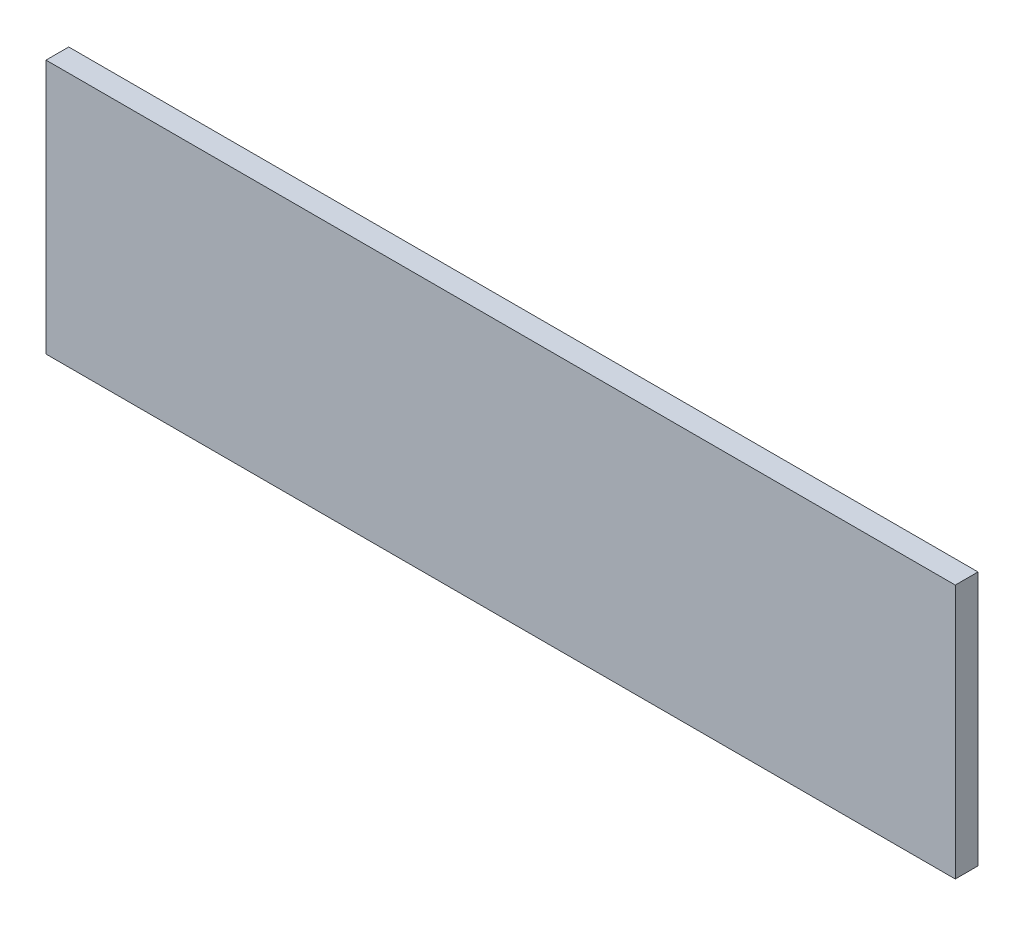
ISO-10303-21;
HEADER;
FILE_DESCRIPTION(('STEP AP214'),'2;1');
FILE_NAME('part.step','',(''),(''),'','','');
FILE_SCHEMA(('AUTOMOTIVE_DESIGN { 1 0 10303 214 1 1 1 1 }'));
ENDSEC;
DATA;
#1=APPLICATION_CONTEXT('core data for automotive mechanical design processes');
#2=APPLICATION_PROTOCOL_DEFINITION('international standard','automotive_design',2000,#1);
#3=PRODUCT_CONTEXT('',#1,'mechanical');
#4=PRODUCT('Part','Part','',(#3));
#5=PRODUCT_RELATED_PRODUCT_CATEGORY('part','',(#4));
#6=PRODUCT_DEFINITION_FORMATION('','',#4);
#7=PRODUCT_DEFINITION_CONTEXT('part definition',#1,'design');
#8=PRODUCT_DEFINITION('design','',#6,#7);
#9=PRODUCT_DEFINITION_SHAPE('','',#8);
#10=(LENGTH_UNIT() NAMED_UNIT(*) SI_UNIT(.MILLI.,.METRE.));
#11=(NAMED_UNIT(*) PLANE_ANGLE_UNIT() SI_UNIT($,.RADIAN.));
#12=(NAMED_UNIT(*) SI_UNIT($,.STERADIAN.) SOLID_ANGLE_UNIT());
#13=UNCERTAINTY_MEASURE_WITH_UNIT(LENGTH_MEASURE(1.E-05),#10,'distance_accuracy_value','');
#14=(GEOMETRIC_REPRESENTATION_CONTEXT(3) GLOBAL_UNCERTAINTY_ASSIGNED_CONTEXT((#13)) GLOBAL_UNIT_ASSIGNED_CONTEXT((#10,
#11,#12)) REPRESENTATION_CONTEXT('',''));
#15=CARTESIAN_POINT('',(0.,0.,0.));
#16=DIRECTION('',(0.,0.,1.));
#17=DIRECTION('',(1.,0.,0.));
#18=AXIS2_PLACEMENT_3D('',#15,#16,#17);
#19=CARTESIAN_POINT('',(0.,0.,3.175));
#20=DIRECTION('',(1.,0.,0.));
#21=DIRECTION('',(0.,1.,0.));
#22=AXIS2_PLACEMENT_3D('',#19,#20,#21);
#23=PLANE('',#22);
#24=DIRECTION('',(0.,-1.,0.));
#25=VECTOR('',#24,1.);
#26=CARTESIAN_POINT('',(0.,0.,0.));
#27=LINE('',#26,#25);
#28=CARTESIAN_POINT('',(0.,35.56,0.));
#29=VERTEX_POINT('',#28);
#30=CARTESIAN_POINT('',(0.,0.,0.));
#31=VERTEX_POINT('',#30);
#32=EDGE_CURVE('E97',#29,#31,#27,.T.);
#33=ORIENTED_EDGE('',*,*,#32,.T.);
#34=DIRECTION('',(0.,0.,-1.));
#35=VECTOR('',#34,1.);
#36=CARTESIAN_POINT('',(0.,0.,3.175));
#37=LINE('',#36,#35);
#38=CARTESIAN_POINT('',(0.,0.,3.175));
#39=VERTEX_POINT('',#38);
#40=EDGE_CURVE('E11',#39,#31,#37,.T.);
#41=ORIENTED_EDGE('',*,*,#40,.F.);
#42=DIRECTION('',(0.,-1.,0.));
#43=VECTOR('',#42,1.);
#44=CARTESIAN_POINT('',(0.,0.,3.175));
#45=LINE('',#44,#43);
#46=CARTESIAN_POINT('',(0.,35.56,3.175));
#47=VERTEX_POINT('',#46);
#48=EDGE_CURVE('E85',#47,#39,#45,.T.);
#49=ORIENTED_EDGE('',*,*,#48,.F.);
#50=DIRECTION('',(0.,0.,-1.));
#51=VECTOR('',#50,1.);
#52=CARTESIAN_POINT('',(0.,35.56,3.175));
#53=LINE('',#52,#51);
#54=EDGE_CURVE('E93',#47,#29,#53,.T.);
#55=ORIENTED_EDGE('',*,*,#54,.T.);
#56=EDGE_LOOP('',(#33,#41,#49,#55));
#57=FACE_BOUND('',#56,.T.);
#58=ADVANCED_FACE('F34',(#57),#23,.F.);
#59=CARTESIAN_POINT('',(0.,0.,3.175));
#60=DIRECTION('',(0.,1.,0.));
#61=DIRECTION('',(0.,0.,1.));
#62=AXIS2_PLACEMENT_3D('',#59,#60,#61);
#63=PLANE('',#62);
#64=DIRECTION('',(1.,0.,0.));
#65=VECTOR('',#64,1.);
#66=CARTESIAN_POINT('',(0.,0.,0.));
#67=LINE('',#66,#65);
#68=CARTESIAN_POINT('',(127.,0.,0.));
#69=VERTEX_POINT('',#68);
#70=EDGE_CURVE('E89',#31,#69,#67,.T.);
#71=ORIENTED_EDGE('',*,*,#70,.T.);
#72=DIRECTION('',(0.,0.,-1.));
#73=VECTOR('',#72,1.);
#74=CARTESIAN_POINT('',(127.,0.,3.175));
#75=LINE('',#74,#73);
#76=CARTESIAN_POINT('',(127.,0.,3.175));
#77=VERTEX_POINT('',#76);
#78=EDGE_CURVE('E42',#77,#69,#75,.T.);
#79=ORIENTED_EDGE('',*,*,#78,.F.);
#80=DIRECTION('',(1.,0.,0.));
#81=VECTOR('',#80,1.);
#82=CARTESIAN_POINT('',(0.,0.,3.175));
#83=LINE('',#82,#81);
#84=EDGE_CURVE('E80',#39,#77,#83,.T.);
#85=ORIENTED_EDGE('',*,*,#84,.F.);
#86=ORIENTED_EDGE('',*,*,#40,.T.);
#87=EDGE_LOOP('',(#71,#79,#85,#86));
#88=FACE_BOUND('',#87,.T.);
#89=ADVANCED_FACE('F88',(#88),#63,.F.);
#90=CARTESIAN_POINT('',(127.,0.,3.175));
#91=DIRECTION('',(-1.,0.,0.));
#92=DIRECTION('',(0.,0.,1.));
#93=AXIS2_PLACEMENT_3D('',#90,#91,#92);
#94=PLANE('',#93);
#95=DIRECTION('',(0.,1.,0.));
#96=VECTOR('',#95,1.);
#97=CARTESIAN_POINT('',(127.,0.,0.));
#98=LINE('',#97,#96);
#99=CARTESIAN_POINT('',(127.,35.56,0.));
#100=VERTEX_POINT('',#99);
#101=EDGE_CURVE('E67',#69,#100,#98,.T.);
#102=ORIENTED_EDGE('',*,*,#101,.T.);
#103=DIRECTION('',(0.,0.,-1.));
#104=VECTOR('',#103,1.);
#105=CARTESIAN_POINT('',(127.,35.56,3.175));
#106=LINE('',#105,#104);
#107=CARTESIAN_POINT('',(127.,35.56,3.175));
#108=VERTEX_POINT('',#107);
#109=EDGE_CURVE('E90',#108,#100,#106,.T.);
#110=ORIENTED_EDGE('',*,*,#109,.F.);
#111=DIRECTION('',(0.,1.,0.));
#112=VECTOR('',#111,1.);
#113=CARTESIAN_POINT('',(127.,0.,3.175));
#114=LINE('',#113,#112);
#115=EDGE_CURVE('E83',#77,#108,#114,.T.);
#116=ORIENTED_EDGE('',*,*,#115,.F.);
#117=ORIENTED_EDGE('',*,*,#78,.T.);
#118=EDGE_LOOP('',(#102,#110,#116,#117));
#119=FACE_BOUND('',#118,.T.);
#120=ADVANCED_FACE('F91',(#119),#94,.F.);
#121=CARTESIAN_POINT('',(0.,35.56,3.175));
#122=DIRECTION('',(0.,-1.,0.));
#123=DIRECTION('',(0.,0.,-1.));
#124=AXIS2_PLACEMENT_3D('',#121,#122,#123);
#125=PLANE('',#124);
#126=DIRECTION('',(-1.,0.,0.));
#127=VECTOR('',#126,1.);
#128=CARTESIAN_POINT('',(0.,35.56,0.));
#129=LINE('',#128,#127);
#130=EDGE_CURVE('E73',#100,#29,#129,.T.);
#131=ORIENTED_EDGE('',*,*,#130,.T.);
#132=ORIENTED_EDGE('',*,*,#54,.F.);
#133=DIRECTION('',(-1.,0.,0.));
#134=VECTOR('',#133,1.);
#135=CARTESIAN_POINT('',(0.,35.56,3.175));
#136=LINE('',#135,#134);
#137=EDGE_CURVE('E50',#108,#47,#136,.T.);
#138=ORIENTED_EDGE('',*,*,#137,.F.);
#139=ORIENTED_EDGE('',*,*,#109,.T.);
#140=EDGE_LOOP('',(#131,#132,#138,#139));
#141=FACE_BOUND('',#140,.T.);
#142=ADVANCED_FACE('F104',(#141),#125,.F.);
#143=CARTESIAN_POINT('',(0.,0.,3.175));
#144=DIRECTION('',(0.,0.,-1.));
#145=DIRECTION('',(-1.,0.,0.));
#146=AXIS2_PLACEMENT_3D('',#143,#144,#145);
#147=PLANE('',#146);
#148=ORIENTED_EDGE('',*,*,#48,.T.);
#149=ORIENTED_EDGE('',*,*,#84,.T.);
#150=ORIENTED_EDGE('',*,*,#115,.T.);
#151=ORIENTED_EDGE('',*,*,#137,.T.);
#152=EDGE_LOOP('',(#148,#149,#150,#151));
#153=FACE_BOUND('',#152,.T.);
#154=ADVANCED_FACE('F81',(#153),#147,.F.);
#155=CARTESIAN_POINT('',(0.,0.,0.));
#156=DIRECTION('',(0.,0.,-1.));
#157=DIRECTION('',(-1.,0.,0.));
#158=AXIS2_PLACEMENT_3D('',#155,#156,#157);
#159=PLANE('',#158);
#160=ORIENTED_EDGE('',*,*,#32,.F.);
#161=ORIENTED_EDGE('',*,*,#130,.F.);
#162=ORIENTED_EDGE('',*,*,#101,.F.);
#163=ORIENTED_EDGE('',*,*,#70,.F.);
#164=EDGE_LOOP('',(#160,#161,#162,#163));
#165=FACE_BOUND('',#164,.T.);
#166=ADVANCED_FACE('F107',(#165),#159,.T.);
#167=CLOSED_SHELL('',(#58,#89,#120,#142,#154,#166));
#168=MANIFOLD_SOLID_BREP('B2',#167);
#169=ADVANCED_BREP_SHAPE_REPRESENTATION('',(#18,#168),#14);
#170=SHAPE_DEFINITION_REPRESENTATION(#9,#169);
ENDSEC;
END-ISO-10303-21;
